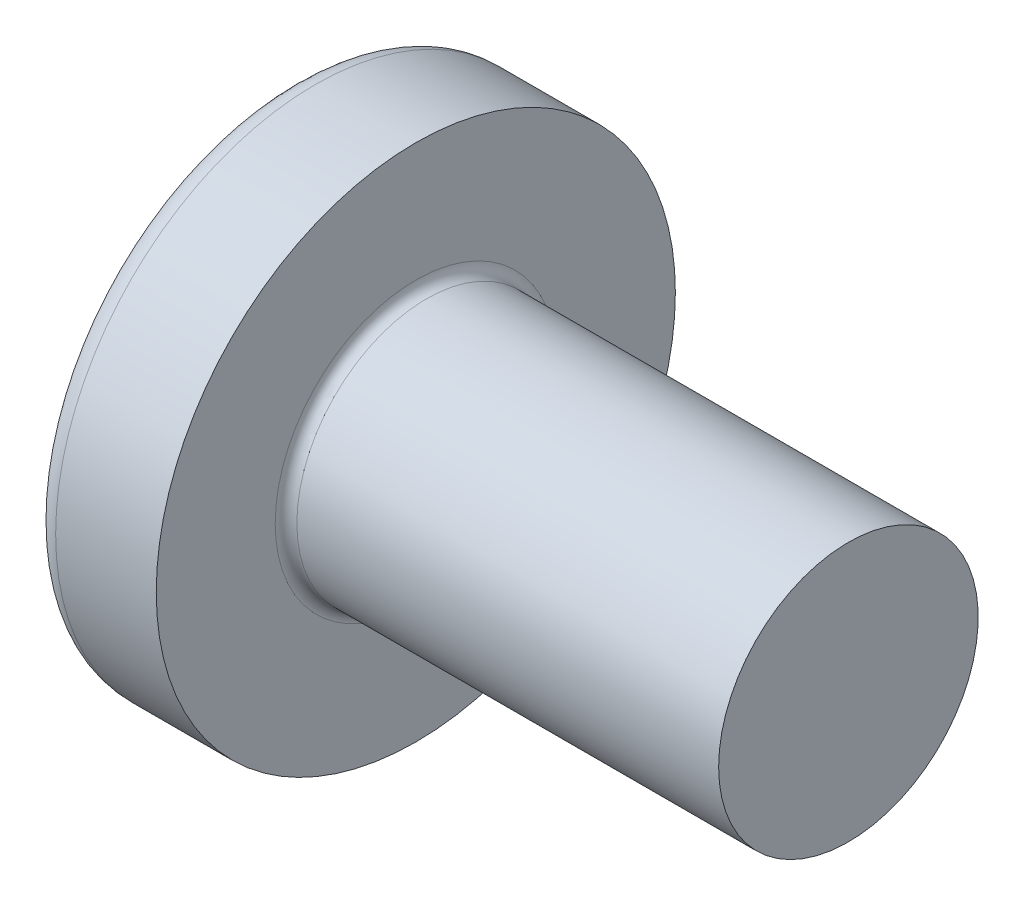
ISO-10303-21;
HEADER;
FILE_DESCRIPTION(('STEP AP214'),'2;1');
FILE_NAME('part.step','',(''),(''),'','','');
FILE_SCHEMA(('AUTOMOTIVE_DESIGN { 1 0 10303 214 1 1 1 1 }'));
ENDSEC;
DATA;
#1=APPLICATION_CONTEXT('core data for automotive mechanical design processes');
#2=APPLICATION_PROTOCOL_DEFINITION('international standard','automotive_design',2000,#1);
#3=PRODUCT_CONTEXT('',#1,'mechanical');
#4=PRODUCT('Part','Part','',(#3));
#5=PRODUCT_RELATED_PRODUCT_CATEGORY('part','',(#4));
#6=PRODUCT_DEFINITION_FORMATION('','',#4);
#7=PRODUCT_DEFINITION_CONTEXT('part definition',#1,'design');
#8=PRODUCT_DEFINITION('design','',#6,#7);
#9=PRODUCT_DEFINITION_SHAPE('','',#8);
#10=(LENGTH_UNIT() NAMED_UNIT(*) SI_UNIT(.MILLI.,.METRE.));
#11=(NAMED_UNIT(*) PLANE_ANGLE_UNIT() SI_UNIT($,.RADIAN.));
#12=(NAMED_UNIT(*) SI_UNIT($,.STERADIAN.) SOLID_ANGLE_UNIT());
#13=UNCERTAINTY_MEASURE_WITH_UNIT(LENGTH_MEASURE(1.E-05),#10,'distance_accuracy_value','');
#14=(GEOMETRIC_REPRESENTATION_CONTEXT(3) GLOBAL_UNCERTAINTY_ASSIGNED_CONTEXT((#13)) GLOBAL_UNIT_ASSIGNED_CONTEXT((#10,
#11,#12)) REPRESENTATION_CONTEXT('',''));
#15=CARTESIAN_POINT('',(0.,0.,0.));
#16=DIRECTION('',(0.,0.,1.));
#17=DIRECTION('',(1.,0.,0.));
#18=AXIS2_PLACEMENT_3D('',#15,#16,#17);
#19=CARTESIAN_POINT('',(10.,0.,0.));
#20=DIRECTION('',(-1.,0.,0.));
#21=DIRECTION('',(0.,1.,0.));
#22=AXIS2_PLACEMENT_3D('',#19,#20,#21);
#23=SPHERICAL_SURFACE('',#22,10.);
#24=CARTESIAN_POINT('',(1.83373872480847,0.,0.));
#25=DIRECTION('',(-1.,0.,0.));
#26=DIRECTION('',(0.,0.,1.));
#27=AXIS2_PLACEMENT_3D('',#24,#25,#26);
#28=CIRCLE('',#27,5.77167019027484);
#29=CARTESIAN_POINT('',(1.83373872480847,0.,5.77167019027484));
#30=VERTEX_POINT('',#29);
#31=EDGE_CURVE('E221',#30,#30,#28,.T.);
#32=ORIENTED_EDGE('',*,*,#31,.T.);
#33=EDGE_LOOP('',(#32));
#34=FACE_BOUND('',#33,.T.);
#35=CARTESIAN_POINT('',(0.11533271177369,0.,0.));
#36=DIRECTION('',(1.,0.,0.));
#37=DIRECTION('',(0.,0.,-1.));
#38=AXIS2_PLACEMENT_3D('',#35,#36,#37);
#39=CIRCLE('',#38,1.51438192047739);
#40=CARTESIAN_POINT('',(0.115332711773693,-0.709999999999995,-1.33762947076864));
#41=VERTEX_POINT('',#40);
#42=CARTESIAN_POINT('',(0.11533271177369,-1.33762947076862,-0.71));
#43=VERTEX_POINT('',#42);
#44=EDGE_CURVE('E348',#41,#43,#39,.F.);
#45=ORIENTED_EDGE('',*,*,#44,.F.);
#46=CARTESIAN_POINT('',(10.,-0.71,0.));
#47=DIRECTION('',(0.,1.,0.));
#48=DIRECTION('',(0.,0.,1.));
#49=AXIS2_PLACEMENT_3D('',#46,#47,#48);
#50=CIRCLE('',#49,9.97476315508293);
#51=CARTESIAN_POINT('',(0.516695966128052,-0.709999999999988,-3.09238493741449));
#52=VERTEX_POINT('',#51);
#53=EDGE_CURVE('E281',#52,#41,#50,.T.);
#54=ORIENTED_EDGE('',*,*,#53,.F.);
#55=CARTESIAN_POINT('',(9.3467899937752,0.,1.31013680591289));
#56=DIRECTION('',(0.446197753347465,0.,-0.894934391398428));
#57=DIRECTION('',(-0.894934391398428,0.,-0.446197753347465));
#58=AXIS2_PLACEMENT_3D('',#55,#56,#57);
#59=CIRCLE('',#58,9.89226254390573);
#60=CARTESIAN_POINT('',(0.516695966128052,0.710000000000011,-3.09238493741448));
#61=VERTEX_POINT('',#60);
#62=EDGE_CURVE('E255',#52,#61,#59,.T.);
#63=ORIENTED_EDGE('',*,*,#62,.T.);
#64=CARTESIAN_POINT('',(10.,0.71,0.));
#65=DIRECTION('',(0.,-1.,0.));
#66=DIRECTION('',(0.,0.,-1.));
#67=AXIS2_PLACEMENT_3D('',#64,#65,#66);
#68=CIRCLE('',#67,9.97476315508293);
#69=CARTESIAN_POINT('',(0.115332711773692,0.710000000000005,-1.33762947076863));
#70=VERTEX_POINT('',#69);
#71=EDGE_CURVE('E310',#70,#61,#68,.T.);
#72=ORIENTED_EDGE('',*,*,#71,.F.);
#73=CARTESIAN_POINT('',(0.11533271177369,1.33762947076862,-0.71));
#74=VERTEX_POINT('',#73);
#75=EDGE_CURVE('E363',#74,#70,#39,.F.);
#76=ORIENTED_EDGE('',*,*,#75,.F.);
#77=CARTESIAN_POINT('',(10.,0.,-0.71));
#78=DIRECTION('',(0.,0.,1.));
#79=DIRECTION('',(1.,0.,0.));
#80=AXIS2_PLACEMENT_3D('',#77,#78,#79);
#81=CIRCLE('',#80,9.97476315508293);
#82=CARTESIAN_POINT('',(0.516695966128064,3.09238493741452,-0.71));
#83=VERTEX_POINT('',#82);
#84=EDGE_CURVE('E249',#83,#74,#81,.T.);
#85=ORIENTED_EDGE('',*,*,#84,.F.);
#86=CARTESIAN_POINT('',(9.34678999377559,-1.31013680591232,0.));
#87=DIRECTION('',(0.446197753347407,0.894934391398457,0.));
#88=DIRECTION('',(-0.894934391398457,0.446197753347407,0.));
#89=AXIS2_PLACEMENT_3D('',#86,#87,#88);
#90=CIRCLE('',#89,9.89226254390583);
#91=CARTESIAN_POINT('',(0.516695966128062,3.09238493741452,0.71));
#92=VERTEX_POINT('',#91);
#93=EDGE_CURVE('E252',#83,#92,#90,.T.);
#94=ORIENTED_EDGE('',*,*,#93,.T.);
#95=CARTESIAN_POINT('',(10.,0.,0.71));
#96=DIRECTION('',(0.,0.,-1.));
#97=DIRECTION('',(0.,1.,0.));
#98=AXIS2_PLACEMENT_3D('',#95,#96,#97);
#99=CIRCLE('',#98,9.97476315508293);
#100=CARTESIAN_POINT('',(0.11533271177369,1.33762947076862,0.71));
#101=VERTEX_POINT('',#100);
#102=EDGE_CURVE('E245',#101,#92,#99,.T.);
#103=ORIENTED_EDGE('',*,*,#102,.F.);
#104=CARTESIAN_POINT('',(0.115332711773693,0.709999999999995,1.33762947076864));
#105=VERTEX_POINT('',#104);
#106=EDGE_CURVE('E362',#105,#101,#39,.F.);
#107=ORIENTED_EDGE('',*,*,#106,.F.);
#108=CARTESIAN_POINT('',(0.516695966128062,0.709999999999989,3.09238493741453));
#109=VERTEX_POINT('',#108);
#110=EDGE_CURVE('E265',#109,#105,#68,.T.);
#111=ORIENTED_EDGE('',*,*,#110,.F.);
#112=CARTESIAN_POINT('',(9.34678999377559,0.,-1.31013680591232));
#113=DIRECTION('',(0.446197753347407,0.,0.894934391398457));
#114=DIRECTION('',(0.894934391398457,0.,-0.446197753347407));
#115=AXIS2_PLACEMENT_3D('',#112,#113,#114);
#116=CIRCLE('',#115,9.89226254390583);
#117=CARTESIAN_POINT('',(0.516695966128062,-0.710000000000011,3.09238493741452));
#118=VERTEX_POINT('',#117);
#119=EDGE_CURVE('E55',#109,#118,#116,.T.);
#120=ORIENTED_EDGE('',*,*,#119,.T.);
#121=CARTESIAN_POINT('',(0.115332711773692,-0.710000000000004,1.33762947076863));
#122=VERTEX_POINT('',#121);
#123=EDGE_CURVE('E262',#122,#118,#50,.T.);
#124=ORIENTED_EDGE('',*,*,#123,.F.);
#125=CARTESIAN_POINT('',(0.11533271177369,-1.33762947076862,0.709999999999999));
#126=VERTEX_POINT('',#125);
#127=EDGE_CURVE('E398',#126,#122,#39,.F.);
#128=ORIENTED_EDGE('',*,*,#127,.F.);
#129=CARTESIAN_POINT('',(0.516695966128052,-3.09238493741449,0.709999999999999));
#130=VERTEX_POINT('',#129);
#131=EDGE_CURVE('E246',#130,#126,#99,.T.);
#132=ORIENTED_EDGE('',*,*,#131,.F.);
#133=CARTESIAN_POINT('',(9.3467899937752,1.31013680591289,0.));
#134=DIRECTION('',(0.446197753347465,-0.894934391398428,0.));
#135=DIRECTION('',(0.894934391398428,0.446197753347465,0.));
#136=AXIS2_PLACEMENT_3D('',#133,#134,#135);
#137=CIRCLE('',#136,9.89226254390573);
#138=CARTESIAN_POINT('',(0.516695966128052,-3.09238493741449,-0.71));
#139=VERTEX_POINT('',#138);
#140=EDGE_CURVE('E242',#130,#139,#137,.T.);
#141=ORIENTED_EDGE('',*,*,#140,.T.);
#142=EDGE_CURVE('E70',#43,#139,#81,.T.);
#143=ORIENTED_EDGE('',*,*,#142,.F.);
#144=EDGE_LOOP('',(#45,#54,#63,#72,#76,#85,#94,#103,#107,#111,#120,#124,#128,#132,#141,#143));
#145=FACE_BOUND('',#144,.T.);
#146=ADVANCED_FACE('F41',(#34,#145),#23,.T.);
#147=CARTESIAN_POINT('',(3.46,1.624907924625,-0.71));
#148=DIRECTION('',(0.,0.,1.));
#149=DIRECTION('',(1.,0.,0.));
#150=AXIS2_PLACEMENT_3D('',#147,#148,#149);
#151=PLANE('',#150);
#152=ORIENTED_EDGE('',*,*,#84,.T.);
#153=CARTESIAN_POINT('',(-2.28089704213722,1.52473965101837,-0.71));
#154=CARTESIAN_POINT('',(-1.81861622822998,1.48907386498352,-0.71));
#155=CARTESIAN_POINT('',(-1.35635131302274,1.45320000395987,-0.71));
#156=CARTESIAN_POINT('',(-0.431857761667543,1.3808964085712,-0.71));
#157=CARTESIAN_POINT('',(0.0303708738054363,1.34446666558133,-0.71));
#158=CARTESIAN_POINT('',(0.954772750089382,1.27091270389059,-0.71));
#159=CARTESIAN_POINT('',(1.41694599093296,1.23378848560061,-0.71));
#160=CARTESIAN_POINT('',(2.1101468655661,1.17741958304234,-0.71));
#161=CARTESIAN_POINT('',(2.34120225142472,1.15851633138213,-0.71));
#162=CARTESIAN_POINT('',(2.80329254149198,1.12044387603508,-0.71));
#163=CARTESIAN_POINT('',(3.03432744556048,1.10127467065167,-0.71));
#164=CARTESIAN_POINT('',(3.81376951672291,1.03608826026628,-0.71));
#165=CARTESIAN_POINT('',(4.3621185642133,0.989367924506424,-0.71));
#166=CARTESIAN_POINT('',(5.18446393534975,0.917336183170652,-0.71));
#167=CARTESIAN_POINT('',(5.45854573527601,0.893000731200899,-0.71));
#168=CARTESIAN_POINT('',(6.00663594033703,0.843493254998865,-0.71));
#169=CARTESIAN_POINT('',(6.28064434495887,0.818321225066341,-0.71));
#170=CARTESIAN_POINT('',(6.82859287274618,0.766879824151132,-0.71));
#171=CARTESIAN_POINT('',(7.10253298312854,0.740610316661091,-0.71));
#172=CARTESIAN_POINT('',(7.65026285025565,0.686585019837831,-0.71));
#173=CARTESIAN_POINT('',(7.92405260972714,0.658829258423122,-0.71));
#174=CARTESIAN_POINT('',(8.33458184018721,0.615573696383427,-0.71));
#175=CARTESIAN_POINT('',(8.4714065534312,0.600884001267348,-0.71));
#176=CARTESIAN_POINT('',(8.74498055470476,0.570826220799602,-0.71));
#177=CARTESIAN_POINT('',(8.88172984329827,0.555458140591717,-0.71));
#178=CARTESIAN_POINT('',(9.15513948220117,0.523868434617907,-0.71));
#179=CARTESIAN_POINT('',(9.29179982631774,0.507646754763106,-0.71));
#180=CARTESIAN_POINT('',(9.56498051884117,0.474039680066355,-0.71));
#181=CARTESIAN_POINT('',(9.70150086350508,0.45665425489429,-0.71));
#182=CARTESIAN_POINT('',(9.83792645731126,0.438531836217977,-0.71));
#183=B_SPLINE_CURVE_WITH_KNOTS('',3,(#153,#154,#155,#156,#157,#158,#159,#160,#161,#162,#163,
#164,#165,#166,#167,#168,#169,#170,#171,#172,#173,#174,#175,#176,#177,#178,#179,#180,#181,#182),
.UNSPECIFIED.,.F.,.F.,(4,2,2,2,2,2,2,2,2,2,2,2,2,2,4),(0.,1.39096401174475,2.78194962715189,
4.17293441960638,4.86841633218882,5.56390268344286,7.21490482310267,8.04038405799492,
8.86586891866053,9.69145676295231,10.5170291044415,10.9298607906012,11.3426893470464,
11.7555440942062,12.1684096055867),.UNSPECIFIED.);
#184=CARTESIAN_POINT('',(3.46,1.06563607765503,-0.710000000000001));
#185=VERTEX_POINT('',#184);
#186=EDGE_CURVE('E385',#74,#185,#183,.T.);
#187=ORIENTED_EDGE('',*,*,#186,.T.);
#188=DIRECTION('',(0.,1.,0.));
#189=VECTOR('',#188,1.);
#190=CARTESIAN_POINT('',(3.46,-1.62490792462472,-0.71));
#191=LINE('',#190,#189);
#192=CARTESIAN_POINT('',(3.46,1.624907924625,-0.71));
#193=VERTEX_POINT('',#192);
#194=EDGE_CURVE('E331',#185,#193,#191,.T.);
#195=ORIENTED_EDGE('',*,*,#194,.T.);
#196=DIRECTION('',(0.894934391398457,-0.446197753347407,0.));
#197=VECTOR('',#196,1.);
#198=CARTESIAN_POINT('',(0.,3.35,-0.71));
#199=LINE('',#198,#197);
#200=EDGE_CURVE('E222',#83,#193,#199,.T.);
#201=ORIENTED_EDGE('',*,*,#200,.F.);
#202=EDGE_LOOP('',(#152,#187,#195,#201));
#203=FACE_BOUND('',#202,.T.);
#204=ADVANCED_FACE('F176',(#203),#151,.T.);
#205=CARTESIAN_POINT('',(3.46,-1.62490792462472,-0.71));
#206=VERTEX_POINT('',#205);
#207=CARTESIAN_POINT('',(3.46,-1.06563607765503,-0.710000000000001));
#208=VERTEX_POINT('',#207);
#209=EDGE_CURVE('E230',#206,#208,#191,.T.);
#210=ORIENTED_EDGE('',*,*,#209,.T.);
#211=CARTESIAN_POINT('',(-2.28089704213722,-1.52473965101837,-0.71));
#212=CARTESIAN_POINT('',(-1.81861622822998,-1.48907386498352,-0.71));
#213=CARTESIAN_POINT('',(-1.35635131302274,-1.45320000395987,-0.71));
#214=CARTESIAN_POINT('',(-0.431857761667543,-1.3808964085712,-0.71));
#215=CARTESIAN_POINT('',(0.0303708738054359,-1.34446666558133,-0.71));
#216=CARTESIAN_POINT('',(0.954772750089383,-1.27091270389059,-0.71));
#217=CARTESIAN_POINT('',(1.41694599093296,-1.23378848560061,-0.71));
#218=CARTESIAN_POINT('',(2.1101468655661,-1.17741958304234,-0.71));
#219=CARTESIAN_POINT('',(2.34120225142472,-1.15851633138213,-0.71));
#220=CARTESIAN_POINT('',(2.80329254149198,-1.12044387603508,-0.71));
#221=CARTESIAN_POINT('',(3.03432744556048,-1.10127467065167,-0.71));
#222=CARTESIAN_POINT('',(3.81376951672291,-1.03608826026628,-0.71));
#223=CARTESIAN_POINT('',(4.3621185642133,-0.989367924506424,-0.71));
#224=CARTESIAN_POINT('',(5.18446393534975,-0.917336183170652,-0.71));
#225=CARTESIAN_POINT('',(5.45854573527601,-0.893000731200899,-0.71));
#226=CARTESIAN_POINT('',(6.00663594033703,-0.843493254998865,-0.71));
#227=CARTESIAN_POINT('',(6.28064434495887,-0.818321225066341,-0.71));
#228=CARTESIAN_POINT('',(6.82859287274618,-0.766879824151132,-0.71));
#229=CARTESIAN_POINT('',(7.10253298312854,-0.740610316661091,-0.71));
#230=CARTESIAN_POINT('',(7.65026285025565,-0.686585019837831,-0.71));
#231=CARTESIAN_POINT('',(7.92405260972714,-0.658829258423123,-0.71));
#232=CARTESIAN_POINT('',(8.33458184018721,-0.615573696383427,-0.71));
#233=CARTESIAN_POINT('',(8.4714065534312,-0.600884001267348,-0.71));
#234=CARTESIAN_POINT('',(8.74498055470476,-0.570826220799602,-0.71));
#235=CARTESIAN_POINT('',(8.88172984329826,-0.555458140591717,-0.71));
#236=CARTESIAN_POINT('',(9.15513948220117,-0.523868434617907,-0.71));
#237=CARTESIAN_POINT('',(9.29179982631774,-0.507646754763106,-0.71));
#238=CARTESIAN_POINT('',(9.56498051884117,-0.474039680066355,-0.71));
#239=CARTESIAN_POINT('',(9.70150086350508,-0.45665425489429,-0.71));
#240=CARTESIAN_POINT('',(9.83792645731126,-0.438531836217976,-0.71));
#241=B_SPLINE_CURVE_WITH_KNOTS('',3,(#211,#212,#213,#214,#215,#216,#217,#218,#219,#220,#221,
#222,#223,#224,#225,#226,#227,#228,#229,#230,#231,#232,#233,#234,#235,#236,#237,#238,#239,#240),
.UNSPECIFIED.,.F.,.F.,(4,2,2,2,2,2,2,2,2,2,2,2,2,2,4),(0.,1.39096401174475,2.78194962715189,
4.17293441960638,4.86841633218882,5.56390268344287,7.21490482310267,8.04038405799492,
8.86586891866053,9.69145676295231,10.5170291044415,10.9298607906012,11.3426893470464,
11.7555440942062,12.1684096055867),.UNSPECIFIED.);
#242=EDGE_CURVE('E361',#208,#43,#241,.F.);
#243=ORIENTED_EDGE('',*,*,#242,.T.);
#244=ORIENTED_EDGE('',*,*,#142,.T.);
#245=DIRECTION('',(0.894934391398428,0.446197753347465,0.));
#246=VECTOR('',#245,1.);
#247=CARTESIAN_POINT('',(0.,-3.35,-0.71));
#248=LINE('',#247,#246);
#249=EDGE_CURVE('E313',#139,#206,#248,.T.);
#250=ORIENTED_EDGE('',*,*,#249,.T.);
#251=EDGE_LOOP('',(#210,#243,#244,#250));
#252=FACE_BOUND('',#251,.T.);
#253=ADVANCED_FACE('F183',(#252),#151,.T.);
#254=CARTESIAN_POINT('',(3.46,-1.62490792462472,0.71));
#255=DIRECTION('',(0.,0.,-1.));
#256=DIRECTION('',(0.,1.,0.));
#257=AXIS2_PLACEMENT_3D('',#254,#255,#256);
#258=PLANE('',#257);
#259=DIRECTION('',(0.,-1.,0.));
#260=VECTOR('',#259,1.);
#261=CARTESIAN_POINT('',(3.46,1.624907924625,0.71));
#262=LINE('',#261,#260);
#263=CARTESIAN_POINT('',(3.46,1.624907924625,0.71));
#264=VERTEX_POINT('',#263);
#265=CARTESIAN_POINT('',(3.46,1.06563607765503,0.71));
#266=VERTEX_POINT('',#265);
#267=EDGE_CURVE('E321',#264,#266,#262,.T.);
#268=ORIENTED_EDGE('',*,*,#267,.T.);
#269=CARTESIAN_POINT('',(-2.28089704213722,1.52473965101837,0.709999999999999));
#270=CARTESIAN_POINT('',(-1.81861622822998,1.48907386498352,0.709999999999999));
#271=CARTESIAN_POINT('',(-1.35635131302274,1.45320000395987,0.709999999999999));
#272=CARTESIAN_POINT('',(-0.431857761667543,1.3808964085712,0.709999999999999));
#273=CARTESIAN_POINT('',(0.0303708738054362,1.34446666558133,0.71));
#274=CARTESIAN_POINT('',(0.954772750089382,1.27091270389059,0.71));
#275=CARTESIAN_POINT('',(1.41694599093296,1.23378848560061,0.71));
#276=CARTESIAN_POINT('',(2.1101468655661,1.17741958304234,0.71));
#277=CARTESIAN_POINT('',(2.34120225142472,1.15851633138213,0.71));
#278=CARTESIAN_POINT('',(2.80329254149198,1.12044387603508,0.71));
#279=CARTESIAN_POINT('',(3.03432744556048,1.10127467065167,0.71));
#280=CARTESIAN_POINT('',(3.81376951672291,1.03608826026628,0.71));
#281=CARTESIAN_POINT('',(4.3621185642133,0.989367924506424,0.71));
#282=CARTESIAN_POINT('',(5.18446393534975,0.917336183170652,0.71));
#283=CARTESIAN_POINT('',(5.45854573527601,0.893000731200899,0.71));
#284=CARTESIAN_POINT('',(6.00663594033703,0.843493254998865,0.71));
#285=CARTESIAN_POINT('',(6.28064434495887,0.818321225066341,0.71));
#286=CARTESIAN_POINT('',(6.82859287274618,0.766879824151132,0.71));
#287=CARTESIAN_POINT('',(7.10253298312854,0.740610316661091,0.71));
#288=CARTESIAN_POINT('',(7.65026285025565,0.686585019837831,0.71));
#289=CARTESIAN_POINT('',(7.92405260972714,0.658829258423123,0.71));
#290=CARTESIAN_POINT('',(8.33458184018721,0.615573696383427,0.71));
#291=CARTESIAN_POINT('',(8.4714065534312,0.600884001267348,0.71));
#292=CARTESIAN_POINT('',(8.74498055470476,0.570826220799602,0.71));
#293=CARTESIAN_POINT('',(8.88172984329826,0.555458140591717,0.71));
#294=CARTESIAN_POINT('',(9.15513948220117,0.523868434617907,0.71));
#295=CARTESIAN_POINT('',(9.29179982631774,0.507646754763106,0.71));
#296=CARTESIAN_POINT('',(9.56498051884117,0.474039680066355,0.71));
#297=CARTESIAN_POINT('',(9.70150086350508,0.456654254894289,0.71));
#298=CARTESIAN_POINT('',(9.83792645731126,0.438531836217976,0.71));
#299=B_SPLINE_CURVE_WITH_KNOTS('',3,(#269,#270,#271,#272,#273,#274,#275,#276,#277,#278,#279,
#280,#281,#282,#283,#284,#285,#286,#287,#288,#289,#290,#291,#292,#293,#294,#295,#296,#297,#298),
.UNSPECIFIED.,.F.,.F.,(4,2,2,2,2,2,2,2,2,2,2,2,2,2,4),(0.,1.39096401174475,2.78194962715189,
4.17293441960638,4.86841633218882,5.56390268344286,7.21490482310267,8.04038405799492,
8.86586891866053,9.69145676295231,10.5170291044415,10.9298607906012,11.3426893470464,
11.7555440942062,12.1684096055867),.UNSPECIFIED.);
#300=EDGE_CURVE('E286',#266,#101,#299,.F.);
#301=ORIENTED_EDGE('',*,*,#300,.T.);
#302=ORIENTED_EDGE('',*,*,#102,.T.);
#303=DIRECTION('',(0.894934391398457,-0.446197753347407,0.));
#304=VECTOR('',#303,1.);
#305=CARTESIAN_POINT('',(0.,3.35,0.71));
#306=LINE('',#305,#304);
#307=EDGE_CURVE('E227',#92,#264,#306,.T.);
#308=ORIENTED_EDGE('',*,*,#307,.T.);
#309=EDGE_LOOP('',(#268,#301,#302,#308));
#310=FACE_BOUND('',#309,.T.);
#311=ADVANCED_FACE('F381',(#310),#258,.T.);
#312=ORIENTED_EDGE('',*,*,#131,.T.);
#313=CARTESIAN_POINT('',(-2.28089705027091,-1.52473965164577,0.709999999999999));
#314=CARTESIAN_POINT('',(-1.81861623532717,-1.48907386553353,0.709999999999999));
#315=CARTESIAN_POINT('',(-1.35635131908348,-1.45320000443187,0.709999999999999));
#316=CARTESIAN_POINT('',(-0.431857765655443,-1.38089640888514,0.709999999999999));
#317=CARTESIAN_POINT('',(0.0303708708539241,-1.3444666658152,0.709999999999999));
#318=CARTESIAN_POINT('',(0.954772749881989,-1.27091270390807,0.709999999999999));
#319=CARTESIAN_POINT('',(1.41694599243322,-1.23378848548075,0.709999999999999));
#320=CARTESIAN_POINT('',(2.11014686962733,-1.17741958271103,0.709999999999999));
#321=CARTESIAN_POINT('',(2.3412022563395,-1.15851633097942,0.71));
#322=CARTESIAN_POINT('',(2.80329254811369,-1.12044387548729,0.71));
#323=CARTESIAN_POINT('',(3.03432745303557,-1.10127467003019,0.71));
#324=CARTESIAN_POINT('',(3.81376952505089,-1.03608825956087,0.71));
#325=CARTESIAN_POINT('',(4.36211857254078,-0.989367923790553,0.71));
#326=CARTESIAN_POINT('',(5.18446394367596,-0.917336182434635,0.71));
#327=CARTESIAN_POINT('',(5.45854574360167,-0.893000730457428,0.71));
#328=CARTESIAN_POINT('',(6.00663594866141,-0.843493254238335,0.71));
#329=CARTESIAN_POINT('',(6.28064435328252,-0.818321224296205,0.71));
#330=CARTESIAN_POINT('',(6.82859288106826,-0.766879823358567,0.71));
#331=CARTESIAN_POINT('',(7.1025329914498,-0.7406103158557,0.71));
#332=CARTESIAN_POINT('',(7.65026285857464,-0.686585019001786,0.71));
#333=CARTESIAN_POINT('',(7.92405261804469,-0.658829257569249,0.71));
#334=CARTESIAN_POINT('',(8.3345818485019,-0.615573695496181,0.71));
#335=CARTESIAN_POINT('',(8.47140656174489,-0.600884000367865,0.71));
#336=CARTESIAN_POINT('',(8.74498056301602,-0.570826219872503,0.71));
#337=CARTESIAN_POINT('',(8.8817298516081,-0.555458139649238,0.71));
#338=CARTESIAN_POINT('',(9.15513949050764,-0.523868433640256,0.71));
#339=CARTESIAN_POINT('',(9.29179983462227,-0.507646753765661,0.71));
#340=CARTESIAN_POINT('',(9.56498052714077,-0.474039679022048,0.71));
#341=CARTESIAN_POINT('',(9.70150087180168,-0.456654253822914,0.71));
#342=CARTESIAN_POINT('',(9.83792646560407,-0.438531835114466,0.71));
#343=B_SPLINE_CURVE_WITH_KNOTS('',3,(#313,#314,#315,#316,#317,#318,#319,#320,#321,#322,#323,
#324,#325,#326,#327,#328,#329,#330,#331,#332,#333,#334,#335,#336,#337,#338,#339,#340,#341,#342),
.UNSPECIFIED.,.F.,.F.,(4,2,2,2,2,2,2,2,2,2,2,2,2,2,4),(0.,1.39096401486289,2.78194963338846,
4.17293443098243,4.86841634613445,5.56390269995814,7.21490483961907,8.04038407451168,
8.8658689351777,9.69145677947068,10.5170291209609,10.9298608071215,11.3426893635676,
11.7555441107285,12.1684096221104),.UNSPECIFIED.);
#344=CARTESIAN_POINT('',(3.46,-1.06563607765503,0.71));
#345=VERTEX_POINT('',#344);
#346=EDGE_CURVE('E399',#126,#345,#343,.T.);
#347=ORIENTED_EDGE('',*,*,#346,.T.);
#348=CARTESIAN_POINT('',(3.46,-1.62490792462472,0.71));
#349=VERTEX_POINT('',#348);
#350=EDGE_CURVE('E323',#345,#349,#262,.T.);
#351=ORIENTED_EDGE('',*,*,#350,.T.);
#352=DIRECTION('',(0.894934391398428,0.446197753347465,0.));
#353=VECTOR('',#352,1.);
#354=CARTESIAN_POINT('',(0.,-3.35,0.709999999999999));
#355=LINE('',#354,#353);
#356=EDGE_CURVE('E315',#130,#349,#355,.T.);
#357=ORIENTED_EDGE('',*,*,#356,.F.);
#358=EDGE_LOOP('',(#312,#347,#351,#357));
#359=FACE_BOUND('',#358,.T.);
#360=ADVANCED_FACE('F428',(#359),#258,.T.);
#361=CARTESIAN_POINT('',(3.46,1.624907924625,-0.71));
#362=DIRECTION('',(-1.,0.,0.));
#363=DIRECTION('',(0.,0.,1.));
#364=AXIS2_PLACEMENT_3D('',#361,#362,#363);
#365=PLANE('',#364);
#366=ORIENTED_EDGE('',*,*,#350,.F.);
#367=CARTESIAN_POINT('',(3.46,0.,0.));
#368=DIRECTION('',(-1.,0.,0.));
#369=DIRECTION('',(0.,0.,1.));
#370=AXIS2_PLACEMENT_3D('',#367,#368,#369);
#371=CIRCLE('',#370,1.2805);
#372=EDGE_CURVE('E356',#208,#345,#371,.T.);
#373=ORIENTED_EDGE('',*,*,#372,.F.);
#374=ORIENTED_EDGE('',*,*,#209,.F.);
#375=DIRECTION('',(0.,0.,1.));
#376=VECTOR('',#375,1.);
#377=CARTESIAN_POINT('',(3.46,-1.62490792462472,-0.71));
#378=LINE('',#377,#376);
#379=EDGE_CURVE('E318',#206,#349,#378,.T.);
#380=ORIENTED_EDGE('',*,*,#379,.T.);
#381=EDGE_LOOP('',(#366,#373,#374,#380));
#382=FACE_BOUND('',#381,.T.);
#383=ADVANCED_FACE('F422',(#382),#365,.T.);
#384=DIRECTION('',(0.,0.,-1.));
#385=VECTOR('',#384,1.);
#386=CARTESIAN_POINT('',(3.46,-0.710000000000005,1.624907924625));
#387=LINE('',#386,#385);
#388=CARTESIAN_POINT('',(3.46,-0.709999999999996,-1.06563607765503));
#389=VERTEX_POINT('',#388);
#390=CARTESIAN_POINT('',(3.46,-0.709999999999994,-1.62490792462472));
#391=VERTEX_POINT('',#390);
#392=EDGE_CURVE('E304',#389,#391,#387,.T.);
#393=ORIENTED_EDGE('',*,*,#392,.F.);
#394=CARTESIAN_POINT('',(3.46,0.710000000000004,-1.06563607765503));
#395=VERTEX_POINT('',#394);
#396=EDGE_CURVE('E62',#395,#389,#371,.T.);
#397=ORIENTED_EDGE('',*,*,#396,.F.);
#398=DIRECTION('',(0.,0.,1.));
#399=VECTOR('',#398,1.);
#400=CARTESIAN_POINT('',(3.46,0.710000000000006,-1.62490792462472));
#401=LINE('',#400,#399);
#402=CARTESIAN_POINT('',(3.46,0.710000000000006,-1.62490792462472));
#403=VERTEX_POINT('',#402);
#404=EDGE_CURVE('E307',#403,#395,#401,.T.);
#405=ORIENTED_EDGE('',*,*,#404,.F.);
#406=DIRECTION('',(0.,-1.,0.));
#407=VECTOR('',#406,1.);
#408=CARTESIAN_POINT('',(3.46,0.710000000000006,-1.62490792462472));
#409=LINE('',#408,#407);
#410=EDGE_CURVE('E298',#403,#391,#409,.T.);
#411=ORIENTED_EDGE('',*,*,#410,.T.);
#412=EDGE_LOOP('',(#393,#397,#405,#411));
#413=FACE_BOUND('',#412,.T.);
#414=ADVANCED_FACE('F351',(#413),#365,.T.);
#415=ORIENTED_EDGE('',*,*,#194,.F.);
#416=EDGE_CURVE('E355',#266,#185,#371,.T.);
#417=ORIENTED_EDGE('',*,*,#416,.F.);
#418=ORIENTED_EDGE('',*,*,#267,.F.);
#419=DIRECTION('',(0.,0.,-1.));
#420=VECTOR('',#419,1.);
#421=CARTESIAN_POINT('',(3.46,1.624907924625,0.71));
#422=LINE('',#421,#420);
#423=EDGE_CURVE('E324',#264,#193,#422,.T.);
#424=ORIENTED_EDGE('',*,*,#423,.T.);
#425=EDGE_LOOP('',(#415,#417,#418,#424));
#426=FACE_BOUND('',#425,.T.);
#427=ADVANCED_FACE('F423',(#426),#365,.T.);
#428=CARTESIAN_POINT('',(3.46,0.709999999999994,1.624907924625));
#429=DIRECTION('',(0.,-1.,0.));
#430=DIRECTION('',(1.,0.,0.));
#431=AXIS2_PLACEMENT_3D('',#428,#429,#430);
#432=PLANE('',#431);
#433=ORIENTED_EDGE('',*,*,#110,.T.);
#434=CARTESIAN_POINT('',(-2.28089704213722,0.709999999999995,1.52473965101837));
#435=CARTESIAN_POINT('',(-1.81861622822998,0.709999999999995,1.48907386498352));
#436=CARTESIAN_POINT('',(-1.35635131302274,0.709999999999995,1.45320000395987));
#437=CARTESIAN_POINT('',(-0.431857761667543,0.709999999999995,1.38089640857121));
#438=CARTESIAN_POINT('',(0.0303708738054362,0.709999999999995,1.34446666558134));
#439=CARTESIAN_POINT('',(0.954772750089383,0.709999999999995,1.2709127038906));
#440=CARTESIAN_POINT('',(1.41694599093296,0.709999999999996,1.23378848560061));
#441=CARTESIAN_POINT('',(2.1101468655661,0.709999999999996,1.17741958304234));
#442=CARTESIAN_POINT('',(2.34120225142472,0.709999999999996,1.15851633138213));
#443=CARTESIAN_POINT('',(2.80329254149198,0.709999999999996,1.12044387603508));
#444=CARTESIAN_POINT('',(3.03432744556048,0.709999999999996,1.10127467065167));
#445=CARTESIAN_POINT('',(3.81376951672291,0.709999999999996,1.03608826026628));
#446=CARTESIAN_POINT('',(4.3621185642133,0.709999999999997,0.989367924506427));
#447=CARTESIAN_POINT('',(5.18446393534975,0.709999999999997,0.917336183170655));
#448=CARTESIAN_POINT('',(5.45854573527601,0.709999999999997,0.893000731200901));
#449=CARTESIAN_POINT('',(6.00663594033703,0.709999999999997,0.843493254998868));
#450=CARTESIAN_POINT('',(6.28064434495887,0.709999999999997,0.818321225066344));
#451=CARTESIAN_POINT('',(6.82859287274618,0.709999999999997,0.766879824151135));
#452=CARTESIAN_POINT('',(7.10253298312854,0.709999999999997,0.740610316661093));
#453=CARTESIAN_POINT('',(7.65026285025565,0.709999999999998,0.686585019837834));
#454=CARTESIAN_POINT('',(7.92405260972714,0.709999999999998,0.658829258423125));
#455=CARTESIAN_POINT('',(8.33458184018721,0.709999999999998,0.615573696383429));
#456=CARTESIAN_POINT('',(8.4714065534312,0.709999999999998,0.60088400126735));
#457=CARTESIAN_POINT('',(8.74498055470476,0.709999999999998,0.570826220799605));
#458=CARTESIAN_POINT('',(8.88172984329826,0.709999999999998,0.55545814059172));
#459=CARTESIAN_POINT('',(9.15513948220117,0.709999999999998,0.52386843461791));
#460=CARTESIAN_POINT('',(9.29179982631774,0.709999999999998,0.507646754763109));
#461=CARTESIAN_POINT('',(9.56498051884117,0.709999999999998,0.474039680066358));
#462=CARTESIAN_POINT('',(9.70150086350508,0.709999999999998,0.456654254894292));
#463=CARTESIAN_POINT('',(9.83792645731126,0.709999999999998,0.438531836217979));
#464=B_SPLINE_CURVE_WITH_KNOTS('',3,(#434,#435,#436,#437,#438,#439,#440,#441,#442,#443,#444,
#445,#446,#447,#448,#449,#450,#451,#452,#453,#454,#455,#456,#457,#458,#459,#460,#461,#462,#463),
.UNSPECIFIED.,.F.,.F.,(4,2,2,2,2,2,2,2,2,2,2,2,2,2,4),(0.,1.39096401174475,2.78194962715189,
4.17293441960638,4.86841633218882,5.56390268344286,7.21490482310267,8.04038405799492,
8.86586891866053,9.69145676295231,10.5170291044415,10.9298607906012,11.3426893470464,
11.7555440942062,12.1684096055867),.UNSPECIFIED.);
#465=CARTESIAN_POINT('',(3.46,0.709999999999996,1.06563607765503));
#466=VERTEX_POINT('',#465);
#467=EDGE_CURVE('E446',#105,#466,#464,.T.);
#468=ORIENTED_EDGE('',*,*,#467,.T.);
#469=CARTESIAN_POINT('',(3.46,0.709999999999994,1.624907924625));
#470=VERTEX_POINT('',#469);
#471=EDGE_CURVE('E279',#466,#470,#401,.T.);
#472=ORIENTED_EDGE('',*,*,#471,.T.);
#473=DIRECTION('',(0.894934391398457,0.,-0.446197753347407));
#474=VECTOR('',#473,1.);
#475=CARTESIAN_POINT('',(0.,0.709999999999988,3.35));
#476=LINE('',#475,#474);
#477=EDGE_CURVE('E272',#109,#470,#476,.T.);
#478=ORIENTED_EDGE('',*,*,#477,.F.);
#479=EDGE_LOOP('',(#433,#468,#472,#478));
#480=FACE_BOUND('',#479,.T.);
#481=ADVANCED_FACE('F276',(#480),#432,.T.);
#482=CARTESIAN_POINT('',(3.46,-0.709999999999994,-1.62490792462472));
#483=DIRECTION('',(0.,1.,0.));
#484=DIRECTION('',(0.,0.,1.));
#485=AXIS2_PLACEMENT_3D('',#482,#483,#484);
#486=PLANE('',#485);
#487=CARTESIAN_POINT('',(3.46,-0.710000000000005,1.624907924625));
#488=VERTEX_POINT('',#487);
#489=CARTESIAN_POINT('',(3.46,-0.710000000000003,1.06563607765503));
#490=VERTEX_POINT('',#489);
#491=EDGE_CURVE('E301',#488,#490,#387,.T.);
#492=ORIENTED_EDGE('',*,*,#491,.T.);
#493=CARTESIAN_POINT('',(-2.28089705027091,-0.710000000000005,1.52473965164577));
#494=CARTESIAN_POINT('',(-1.81861623532717,-0.710000000000005,1.48907386553353));
#495=CARTESIAN_POINT('',(-1.35635131908348,-0.710000000000005,1.45320000443187));
#496=CARTESIAN_POINT('',(-0.431857765655443,-0.710000000000004,1.38089640888513));
#497=CARTESIAN_POINT('',(0.030370870853924,-0.710000000000004,1.3444666658152));
#498=CARTESIAN_POINT('',(0.954772749881989,-0.710000000000004,1.27091270390807));
#499=CARTESIAN_POINT('',(1.41694599243322,-0.710000000000004,1.23378848548075));
#500=CARTESIAN_POINT('',(2.11014686962733,-0.710000000000004,1.17741958271102));
#501=CARTESIAN_POINT('',(2.3412022563395,-0.710000000000004,1.15851633097942));
#502=CARTESIAN_POINT('',(2.80329254811369,-0.710000000000004,1.12044387548729));
#503=CARTESIAN_POINT('',(3.03432745303557,-0.710000000000004,1.10127467003019));
#504=CARTESIAN_POINT('',(3.81376952505089,-0.710000000000003,1.03608825956087));
#505=CARTESIAN_POINT('',(4.36211857254078,-0.710000000000003,0.989367923790551));
#506=CARTESIAN_POINT('',(5.18446394367596,-0.710000000000003,0.917336182434633));
#507=CARTESIAN_POINT('',(5.45854574360167,-0.710000000000003,0.893000730457425));
#508=CARTESIAN_POINT('',(6.00663594866141,-0.710000000000003,0.843493254238332));
#509=CARTESIAN_POINT('',(6.28064435328251,-0.710000000000003,0.818321224296203));
#510=CARTESIAN_POINT('',(6.82859288106826,-0.710000000000003,0.766879823358565));
#511=CARTESIAN_POINT('',(7.1025329914498,-0.710000000000003,0.740610315855698));
#512=CARTESIAN_POINT('',(7.65026285857464,-0.710000000000002,0.686585019001784));
#513=CARTESIAN_POINT('',(7.92405261804469,-0.710000000000002,0.658829257569246));
#514=CARTESIAN_POINT('',(8.33458184850189,-0.710000000000002,0.615573695496179));
#515=CARTESIAN_POINT('',(8.47140656174489,-0.710000000000002,0.600884000367863));
#516=CARTESIAN_POINT('',(8.74498056301602,-0.710000000000002,0.5708262198725));
#517=CARTESIAN_POINT('',(8.8817298516081,-0.710000000000002,0.555458139649236));
#518=CARTESIAN_POINT('',(9.15513949050764,-0.710000000000002,0.523868433640253));
#519=CARTESIAN_POINT('',(9.29179983462226,-0.710000000000002,0.507646753765658));
#520=CARTESIAN_POINT('',(9.56498052714076,-0.710000000000002,0.474039679022046));
#521=CARTESIAN_POINT('',(9.70150087180168,-0.710000000000002,0.456654253822912));
#522=CARTESIAN_POINT('',(9.83792646560407,-0.710000000000002,0.438531835114463));
#523=B_SPLINE_CURVE_WITH_KNOTS('',3,(#493,#494,#495,#496,#497,#498,#499,#500,#501,#502,#503,
#504,#505,#506,#507,#508,#509,#510,#511,#512,#513,#514,#515,#516,#517,#518,#519,#520,#521,#522),
.UNSPECIFIED.,.F.,.F.,(4,2,2,2,2,2,2,2,2,2,2,2,2,2,4),(0.,1.39096401486289,2.78194963338846,
4.17293443098243,4.86841634613445,5.56390269995814,7.21490483961907,8.04038407451168,
8.8658689351777,9.69145677947067,10.5170291209609,10.9298608071215,11.3426893635676,
11.7555441107285,12.1684096221104),.UNSPECIFIED.);
#524=EDGE_CURVE('E391',#490,#122,#523,.F.);
#525=ORIENTED_EDGE('',*,*,#524,.T.);
#526=ORIENTED_EDGE('',*,*,#123,.T.);
#527=DIRECTION('',(0.894934391398457,0.,-0.446197753347407));
#528=VECTOR('',#527,1.);
#529=CARTESIAN_POINT('',(0.,-0.710000000000012,3.35));
#530=LINE('',#529,#528);
#531=EDGE_CURVE('E274',#118,#488,#530,.T.);
#532=ORIENTED_EDGE('',*,*,#531,.T.);
#533=EDGE_LOOP('',(#492,#525,#526,#532));
#534=FACE_BOUND('',#533,.T.);
#535=ADVANCED_FACE('F212',(#534),#486,.T.);
#536=ORIENTED_EDGE('',*,*,#404,.T.);
#537=CARTESIAN_POINT('',(-2.28089704213722,0.710000000000005,-1.52473965101837));
#538=CARTESIAN_POINT('',(-1.81861622822998,0.710000000000005,-1.48907386498351));
#539=CARTESIAN_POINT('',(-1.35635131302274,0.710000000000005,-1.45320000395987));
#540=CARTESIAN_POINT('',(-0.431857761667543,0.710000000000005,-1.3808964085712));
#541=CARTESIAN_POINT('',(0.0303708738054363,0.710000000000005,-1.34446666558133));
#542=CARTESIAN_POINT('',(0.954772750089382,0.710000000000004,-1.27091270389059));
#543=CARTESIAN_POINT('',(1.41694599093296,0.710000000000004,-1.23378848560061));
#544=CARTESIAN_POINT('',(2.1101468655661,0.710000000000004,-1.17741958304234));
#545=CARTESIAN_POINT('',(2.34120225142472,0.710000000000004,-1.15851633138212));
#546=CARTESIAN_POINT('',(2.80329254149198,0.710000000000004,-1.12044387603508));
#547=CARTESIAN_POINT('',(3.03432744556048,0.710000000000004,-1.10127467065166));
#548=CARTESIAN_POINT('',(3.81376951672291,0.710000000000004,-1.03608826026627));
#549=CARTESIAN_POINT('',(4.3621185642133,0.710000000000004,-0.989367924506422));
#550=CARTESIAN_POINT('',(5.18446393534975,0.710000000000003,-0.91733618317065));
#551=CARTESIAN_POINT('',(5.45854573527601,0.710000000000003,-0.893000731200896));
#552=CARTESIAN_POINT('',(6.00663594033703,0.710000000000003,-0.843493254998863));
#553=CARTESIAN_POINT('',(6.28064434495887,0.710000000000003,-0.818321225066339));
#554=CARTESIAN_POINT('',(6.82859287274618,0.710000000000003,-0.76687982415113));
#555=CARTESIAN_POINT('',(7.10253298312854,0.710000000000003,-0.740610316661088));
#556=CARTESIAN_POINT('',(7.65026285025565,0.710000000000002,-0.686585019837829));
#557=CARTESIAN_POINT('',(7.92405260972714,0.710000000000002,-0.65882925842312));
#558=CARTESIAN_POINT('',(8.33458184018721,0.710000000000002,-0.615573696383424));
#559=CARTESIAN_POINT('',(8.4714065534312,0.710000000000002,-0.600884001267345));
#560=CARTESIAN_POINT('',(8.74498055470476,0.710000000000002,-0.5708262207996));
#561=CARTESIAN_POINT('',(8.88172984329827,0.710000000000002,-0.555458140591715));
#562=CARTESIAN_POINT('',(9.15513948220117,0.710000000000002,-0.523868434617905));
#563=CARTESIAN_POINT('',(9.29179982631774,0.710000000000002,-0.507646754763103));
#564=CARTESIAN_POINT('',(9.56498051884117,0.710000000000002,-0.474039680066353));
#565=CARTESIAN_POINT('',(9.70150086350508,0.710000000000001,-0.456654254894287));
#566=CARTESIAN_POINT('',(9.83792645731126,0.710000000000001,-0.438531836217974));
#567=B_SPLINE_CURVE_WITH_KNOTS('',3,(#537,#538,#539,#540,#541,#542,#543,#544,#545,#546,#547,
#548,#549,#550,#551,#552,#553,#554,#555,#556,#557,#558,#559,#560,#561,#562,#563,#564,#565,#566),
.UNSPECIFIED.,.F.,.F.,(4,2,2,2,2,2,2,2,2,2,2,2,2,2,4),(0.,1.39096401174475,2.78194962715189,
4.17293441960638,4.86841633218882,5.56390268344286,7.21490482310267,8.04038405799492,
8.86586891866053,9.69145676295231,10.5170291044415,10.9298607906012,11.3426893470464,
11.7555440942062,12.1684096055867),.UNSPECIFIED.);
#568=EDGE_CURVE('E340',#395,#70,#567,.F.);
#569=ORIENTED_EDGE('',*,*,#568,.T.);
#570=ORIENTED_EDGE('',*,*,#71,.T.);
#571=DIRECTION('',(0.894934391398428,0.,0.446197753347465));
#572=VECTOR('',#571,1.);
#573=CARTESIAN_POINT('',(0.,0.710000000000012,-3.35));
#574=LINE('',#573,#572);
#575=EDGE_CURVE('E283',#61,#403,#574,.T.);
#576=ORIENTED_EDGE('',*,*,#575,.T.);
#577=EDGE_LOOP('',(#536,#569,#570,#576));
#578=FACE_BOUND('',#577,.T.);
#579=ADVANCED_FACE('F210',(#578),#432,.T.);
#580=ORIENTED_EDGE('',*,*,#53,.T.);
#581=CARTESIAN_POINT('',(-2.28089705027091,-0.709999999999994,-1.52473965164578));
#582=CARTESIAN_POINT('',(-1.81861623532717,-0.709999999999994,-1.48907386553354));
#583=CARTESIAN_POINT('',(-1.35635131908348,-0.709999999999994,-1.45320000443188));
#584=CARTESIAN_POINT('',(-0.431857765655442,-0.709999999999995,-1.38089640888514));
#585=CARTESIAN_POINT('',(0.0303708708539244,-0.709999999999995,-1.34446666581521));
#586=CARTESIAN_POINT('',(0.954772749881989,-0.709999999999995,-1.27091270390808));
#587=CARTESIAN_POINT('',(1.41694599243322,-0.709999999999995,-1.23378848548076));
#588=CARTESIAN_POINT('',(2.11014686962733,-0.709999999999995,-1.17741958271103));
#589=CARTESIAN_POINT('',(2.3412022563395,-0.709999999999995,-1.15851633097942));
#590=CARTESIAN_POINT('',(2.80329254811369,-0.709999999999996,-1.12044387548729));
#591=CARTESIAN_POINT('',(3.03432745303557,-0.709999999999996,-1.1012746700302));
#592=CARTESIAN_POINT('',(3.8137695250509,-0.709999999999996,-1.03608825956087));
#593=CARTESIAN_POINT('',(4.36211857254078,-0.709999999999996,-0.989367923790556));
#594=CARTESIAN_POINT('',(5.18446394367596,-0.709999999999996,-0.917336182434638));
#595=CARTESIAN_POINT('',(5.45854574360167,-0.709999999999997,-0.89300073045743));
#596=CARTESIAN_POINT('',(6.00663594866141,-0.709999999999997,-0.843493254238337));
#597=CARTESIAN_POINT('',(6.28064435328252,-0.709999999999997,-0.818321224296208));
#598=CARTESIAN_POINT('',(6.82859288106826,-0.709999999999997,-0.76687982335857));
#599=CARTESIAN_POINT('',(7.1025329914498,-0.709999999999997,-0.740610315855703));
#600=CARTESIAN_POINT('',(7.65026285857464,-0.709999999999997,-0.686585019001789));
#601=CARTESIAN_POINT('',(7.92405261804469,-0.709999999999998,-0.658829257569251));
#602=CARTESIAN_POINT('',(8.3345818485019,-0.709999999999998,-0.615573695496184));
#603=CARTESIAN_POINT('',(8.47140656174489,-0.709999999999998,-0.600884000367868));
#604=CARTESIAN_POINT('',(8.74498056301602,-0.709999999999998,-0.570826219872505));
#605=CARTESIAN_POINT('',(8.8817298516081,-0.709999999999998,-0.555458139649241));
#606=CARTESIAN_POINT('',(9.15513949050764,-0.709999999999998,-0.523868433640258));
#607=CARTESIAN_POINT('',(9.29179983462226,-0.709999999999998,-0.507646753765664));
#608=CARTESIAN_POINT('',(9.56498052714076,-0.709999999999998,-0.474039679022051));
#609=CARTESIAN_POINT('',(9.70150087180168,-0.709999999999998,-0.456654253822917));
#610=CARTESIAN_POINT('',(9.83792646560407,-0.709999999999999,-0.438531835114468));
#611=B_SPLINE_CURVE_WITH_KNOTS('',3,(#581,#582,#583,#584,#585,#586,#587,#588,#589,#590,#591,
#592,#593,#594,#595,#596,#597,#598,#599,#600,#601,#602,#603,#604,#605,#606,#607,#608,#609,#610),
.UNSPECIFIED.,.F.,.F.,(4,2,2,2,2,2,2,2,2,2,2,2,2,2,4),(0.,1.39096401486289,2.78194963338846,
4.17293443098243,4.86841634613445,5.56390269995814,7.21490483961907,8.04038407451168,
8.8658689351777,9.69145677947067,10.5170291209609,10.9298608071215,11.3426893635676,
11.7555441107285,12.1684096221104),.UNSPECIFIED.);
#612=EDGE_CURVE('E11',#41,#389,#611,.T.);
#613=ORIENTED_EDGE('',*,*,#612,.T.);
#614=ORIENTED_EDGE('',*,*,#392,.T.);
#615=DIRECTION('',(0.894934391398428,0.,0.446197753347465));
#616=VECTOR('',#615,1.);
#617=CARTESIAN_POINT('',(0.,-0.709999999999987,-3.35));
#618=LINE('',#617,#616);
#619=EDGE_CURVE('E295',#52,#391,#618,.T.);
#620=ORIENTED_EDGE('',*,*,#619,.F.);
#621=EDGE_LOOP('',(#580,#613,#614,#620));
#622=FACE_BOUND('',#621,.T.);
#623=ADVANCED_FACE('F205',(#622),#486,.T.);
#624=CARTESIAN_POINT('',(-25.4,0.,0.));
#625=DIRECTION('',(-1.,0.,0.));
#626=DIRECTION('',(0.,0.,1.));
#627=AXIS2_PLACEMENT_3D('',#624,#625,#626);
#628=CYLINDRICAL_SURFACE('',#627,3.);
#629=CARTESIAN_POINT('',(4.85,0.,0.));
#630=DIRECTION('',(-1.,0.,0.));
#631=DIRECTION('',(0.,0.,1.));
#632=AXIS2_PLACEMENT_3D('',#629,#630,#631);
#633=CIRCLE('',#632,3.);
#634=CARTESIAN_POINT('',(4.85,0.,3.));
#635=VERTEX_POINT('',#634);
#636=EDGE_CURVE('E216',#635,#635,#633,.F.);
#637=ORIENTED_EDGE('',*,*,#636,.T.);
#638=EDGE_LOOP('',(#637));
#639=FACE_BOUND('',#638,.T.);
#640=CARTESIAN_POINT('',(14.6,0.,0.));
#641=DIRECTION('',(-1.,0.,0.));
#642=DIRECTION('',(0.,0.,1.));
#643=AXIS2_PLACEMENT_3D('',#640,#641,#642);
#644=CIRCLE('',#643,3.);
#645=CARTESIAN_POINT('',(14.6,0.,3.));
#646=VERTEX_POINT('',#645);
#647=EDGE_CURVE('E219',#646,#646,#644,.T.);
#648=ORIENTED_EDGE('',*,*,#647,.T.);
#649=EDGE_LOOP('',(#648));
#650=FACE_BOUND('',#649,.T.);
#651=ADVANCED_FACE('F202',(#639,#650),#628,.T.);
#652=CARTESIAN_POINT('',(4.6,3.,0.));
#653=DIRECTION('',(-1.,0.,0.));
#654=DIRECTION('',(0.,0.,1.));
#655=AXIS2_PLACEMENT_3D('',#652,#653,#654);
#656=PLANE('',#655);
#657=CARTESIAN_POINT('',(4.6,0.,0.));
#658=DIRECTION('',(-1.,0.,0.));
#659=DIRECTION('',(0.,0.,1.));
#660=AXIS2_PLACEMENT_3D('',#657,#658,#659);
#661=CIRCLE('',#660,3.25);
#662=CARTESIAN_POINT('',(4.6,0.,3.25));
#663=VERTEX_POINT('',#662);
#664=EDGE_CURVE('E238',#663,#663,#661,.T.);
#665=ORIENTED_EDGE('',*,*,#664,.T.);
#666=EDGE_LOOP('',(#665));
#667=FACE_BOUND('',#666,.T.);
#668=CARTESIAN_POINT('',(4.6,0.,0.));
#669=DIRECTION('',(-1.,0.,0.));
#670=DIRECTION('',(0.,0.,1.));
#671=AXIS2_PLACEMENT_3D('',#668,#669,#670);
#672=CIRCLE('',#671,6.);
#673=CARTESIAN_POINT('',(4.6,0.,6.));
#674=VERTEX_POINT('',#673);
#675=EDGE_CURVE('E235',#674,#674,#672,.T.);
#676=ORIENTED_EDGE('',*,*,#675,.F.);
#677=EDGE_LOOP('',(#676));
#678=FACE_BOUND('',#677,.T.);
#679=ADVANCED_FACE('F199',(#667,#678),#656,.F.);
#680=CARTESIAN_POINT('',(-25.4,0.,0.));
#681=DIRECTION('',(-1.,0.,0.));
#682=DIRECTION('',(0.,0.,1.));
#683=AXIS2_PLACEMENT_3D('',#680,#681,#682);
#684=CYLINDRICAL_SURFACE('',#683,6.);
#685=ORIENTED_EDGE('',*,*,#675,.T.);
#686=EDGE_LOOP('',(#685));
#687=FACE_BOUND('',#686,.T.);
#688=CARTESIAN_POINT('',(2.27471683366882,0.,0.));
#689=DIRECTION('',(-1.,0.,0.));
#690=DIRECTION('',(0.,0.,1.));
#691=AXIS2_PLACEMENT_3D('',#688,#689,#690);
#692=CIRCLE('',#691,6.);
#693=CARTESIAN_POINT('',(2.27471683366882,0.,6.));
#694=VERTEX_POINT('',#693);
#695=EDGE_CURVE('E224',#694,#694,#692,.T.);
#696=ORIENTED_EDGE('',*,*,#695,.F.);
#697=EDGE_LOOP('',(#696));
#698=FACE_BOUND('',#697,.T.);
#699=ADVANCED_FACE('F195',(#687,#698),#684,.T.);
#700=CARTESIAN_POINT('',(2.27471683366882,0.,0.));
#701=DIRECTION('',(-1.,0.,0.));
#702=DIRECTION('',(0.,0.,1.));
#703=AXIS2_PLACEMENT_3D('',#700,#701,#702);
#704=TOROIDAL_SURFACE('',#703,5.46,0.54);
#705=ORIENTED_EDGE('',*,*,#695,.T.);
#706=EDGE_LOOP('',(#705));
#707=FACE_BOUND('',#706,.T.);
#708=ORIENTED_EDGE('',*,*,#31,.F.);
#709=EDGE_LOOP('',(#708));
#710=FACE_BOUND('',#709,.T.);
#711=ADVANCED_FACE('F192',(#707,#710),#704,.T.);
#712=CARTESIAN_POINT('',(14.6,3.,0.));
#713=DIRECTION('',(1.,0.,0.));
#714=DIRECTION('',(0.,0.,-1.));
#715=AXIS2_PLACEMENT_3D('',#712,#713,#714);
#716=PLANE('',#715);
#717=ORIENTED_EDGE('',*,*,#647,.F.);
#718=EDGE_LOOP('',(#717));
#719=FACE_BOUND('',#718,.T.);
#720=ADVANCED_FACE('F190',(#719),#716,.T.);
#721=CARTESIAN_POINT('',(4.85,0.,0.));
#722=DIRECTION('',(-1.,0.,0.));
#723=DIRECTION('',(0.,0.,1.));
#724=AXIS2_PLACEMENT_3D('',#721,#722,#723);
#725=TOROIDAL_SURFACE('',#724,3.25,0.25);
#726=ORIENTED_EDGE('',*,*,#636,.F.);
#727=EDGE_LOOP('',(#726));
#728=FACE_BOUND('',#727,.T.);
#729=ORIENTED_EDGE('',*,*,#664,.F.);
#730=EDGE_LOOP('',(#729));
#731=FACE_BOUND('',#730,.T.);
#732=ADVANCED_FACE('F43',(#728,#731),#725,.F.);
#733=CARTESIAN_POINT('',(3.46,1.624907924625,0.71));
#734=DIRECTION('',(0.446197753347407,0.894934391398457,0.));
#735=DIRECTION('',(-0.894934391398457,0.446197753347407,0.));
#736=AXIS2_PLACEMENT_3D('',#733,#734,#735);
#737=PLANE('',#736);
#738=ORIENTED_EDGE('',*,*,#200,.T.);
#739=ORIENTED_EDGE('',*,*,#423,.F.);
#740=ORIENTED_EDGE('',*,*,#307,.F.);
#741=ORIENTED_EDGE('',*,*,#93,.F.);
#742=EDGE_LOOP('',(#738,#739,#740,#741));
#743=FACE_BOUND('',#742,.T.);
#744=ADVANCED_FACE('F379',(#743),#737,.F.);
#745=CARTESIAN_POINT('',(3.46,-1.62490792462472,-0.71));
#746=DIRECTION('',(0.446197753347465,-0.894934391398428,0.));
#747=DIRECTION('',(0.894934391398428,0.446197753347465,0.));
#748=AXIS2_PLACEMENT_3D('',#745,#746,#747);
#749=PLANE('',#748);
#750=ORIENTED_EDGE('',*,*,#356,.T.);
#751=ORIENTED_EDGE('',*,*,#379,.F.);
#752=ORIENTED_EDGE('',*,*,#249,.F.);
#753=ORIENTED_EDGE('',*,*,#140,.F.);
#754=EDGE_LOOP('',(#750,#751,#752,#753));
#755=FACE_BOUND('',#754,.T.);
#756=ADVANCED_FACE('F420',(#755),#749,.F.);
#757=ORIENTED_EDGE('',*,*,#471,.F.);
#758=EDGE_CURVE('E359',#490,#466,#371,.T.);
#759=ORIENTED_EDGE('',*,*,#758,.F.);
#760=ORIENTED_EDGE('',*,*,#491,.F.);
#761=DIRECTION('',(0.,1.,0.));
#762=VECTOR('',#761,1.);
#763=CARTESIAN_POINT('',(3.46,-0.710000000000005,1.624907924625));
#764=LINE('',#763,#762);
#765=EDGE_CURVE('E305',#488,#470,#764,.T.);
#766=ORIENTED_EDGE('',*,*,#765,.T.);
#767=EDGE_LOOP('',(#757,#759,#760,#766));
#768=FACE_BOUND('',#767,.T.);
#769=ADVANCED_FACE('F415',(#768),#365,.T.);
#770=CARTESIAN_POINT('',(3.46,-0.710000000000005,1.624907924625));
#771=DIRECTION('',(0.446197753347407,0.,0.894934391398457));
#772=DIRECTION('',(-0.894934391398457,0.,0.446197753347407));
#773=AXIS2_PLACEMENT_3D('',#770,#771,#772);
#774=PLANE('',#773);
#775=ORIENTED_EDGE('',*,*,#477,.T.);
#776=ORIENTED_EDGE('',*,*,#765,.F.);
#777=ORIENTED_EDGE('',*,*,#531,.F.);
#778=ORIENTED_EDGE('',*,*,#119,.F.);
#779=EDGE_LOOP('',(#775,#776,#777,#778));
#780=FACE_BOUND('',#779,.T.);
#781=ADVANCED_FACE('F270',(#780),#774,.F.);
#782=CARTESIAN_POINT('',(3.46,0.710000000000006,-1.62490792462472));
#783=DIRECTION('',(0.446197753347465,0.,-0.894934391398428));
#784=DIRECTION('',(0.894934391398428,0.,0.446197753347465));
#785=AXIS2_PLACEMENT_3D('',#782,#783,#784);
#786=PLANE('',#785);
#787=ORIENTED_EDGE('',*,*,#619,.T.);
#788=ORIENTED_EDGE('',*,*,#410,.F.);
#789=ORIENTED_EDGE('',*,*,#575,.F.);
#790=ORIENTED_EDGE('',*,*,#62,.F.);
#791=EDGE_LOOP('',(#787,#788,#789,#790));
#792=FACE_BOUND('',#791,.T.);
#793=ADVANCED_FACE('F343',(#792),#786,.F.);
#794=CARTESIAN_POINT('',(3.46,0.,0.));
#795=DIRECTION('',(-1.,0.,0.));
#796=DIRECTION('',(0.,0.,1.));
#797=AXIS2_PLACEMENT_3D('',#794,#795,#796);
#798=CONICAL_SURFACE('',#797,1.2805,0.0698131700797659);
#799=EDGE_CURVE('E357',#466,#266,#371,.T.);
#800=ORIENTED_EDGE('',*,*,#799,.F.);
#801=ORIENTED_EDGE('',*,*,#467,.F.);
#802=ORIENTED_EDGE('',*,*,#106,.T.);
#803=ORIENTED_EDGE('',*,*,#300,.F.);
#804=EDGE_LOOP('',(#800,#801,#802,#803));
#805=FACE_BOUND('',#804,.T.);
#806=ADVANCED_FACE('F173',(#805),#798,.F.);
#807=ORIENTED_EDGE('',*,*,#127,.T.);
#808=ORIENTED_EDGE('',*,*,#524,.F.);
#809=EDGE_CURVE('E455',#345,#490,#371,.T.);
#810=ORIENTED_EDGE('',*,*,#809,.F.);
#811=ORIENTED_EDGE('',*,*,#346,.F.);
#812=EDGE_LOOP('',(#807,#808,#810,#811));
#813=FACE_BOUND('',#812,.T.);
#814=ADVANCED_FACE('F413',(#813),#798,.F.);
#815=ORIENTED_EDGE('',*,*,#75,.T.);
#816=ORIENTED_EDGE('',*,*,#568,.F.);
#817=EDGE_CURVE('E352',#185,#395,#371,.T.);
#818=ORIENTED_EDGE('',*,*,#817,.F.);
#819=ORIENTED_EDGE('',*,*,#186,.F.);
#820=EDGE_LOOP('',(#815,#816,#818,#819));
#821=FACE_BOUND('',#820,.T.);
#822=ADVANCED_FACE('F171',(#821),#798,.F.);
#823=EDGE_CURVE('E353',#389,#208,#371,.T.);
#824=ORIENTED_EDGE('',*,*,#823,.F.);
#825=ORIENTED_EDGE('',*,*,#612,.F.);
#826=ORIENTED_EDGE('',*,*,#44,.T.);
#827=ORIENTED_EDGE('',*,*,#242,.F.);
#828=EDGE_LOOP('',(#824,#825,#826,#827));
#829=FACE_BOUND('',#828,.T.);
#830=ADVANCED_FACE('F166',(#829),#798,.F.);
#831=CARTESIAN_POINT('',(3.87605967102623,0.,0.));
#832=DIRECTION('',(-1.,0.,0.));
#833=DIRECTION('',(0.,0.,1.));
#834=AXIS2_PLACEMENT_3D('',#831,#832,#833);
#835=CONICAL_SURFACE('',#834,0.,1.25663706143592);
#836=ORIENTED_EDGE('',*,*,#799,.T.);
#837=ORIENTED_EDGE('',*,*,#416,.T.);
#838=ORIENTED_EDGE('',*,*,#817,.T.);
#839=ORIENTED_EDGE('',*,*,#396,.T.);
#840=ORIENTED_EDGE('',*,*,#823,.T.);
#841=ORIENTED_EDGE('',*,*,#372,.T.);
#842=ORIENTED_EDGE('',*,*,#809,.T.);
#843=ORIENTED_EDGE('',*,*,#758,.T.);
#844=EDGE_LOOP('',(#836,#837,#838,#839,#840,#841,#842,#843));
#845=FACE_BOUND('',#844,.T.);
#846=CARTESIAN_POINT('',(3.87605967102623,0.,0.));
#847=VERTEX_POINT('',#846);
#848=VERTEX_LOOP('',#847);
#849=FACE_BOUND('',#848,.T.);
#850=ADVANCED_FACE('F164',(#845,#849),#835,.F.);
#851=CLOSED_SHELL('',(#146,#204,#253,#311,#360,#383,#414,#427,#481,#535,#579,#623,#651,#679,
#699,#711,#720,#732,#744,#756,#769,#781,#793,#806,#814,#822,#830,#850));
#852=MANIFOLD_SOLID_BREP('B2',#851);
#853=ADVANCED_BREP_SHAPE_REPRESENTATION('',(#18,#852),#14);
#854=SHAPE_DEFINITION_REPRESENTATION(#9,#853);
ENDSEC;
END-ISO-10303-21;
